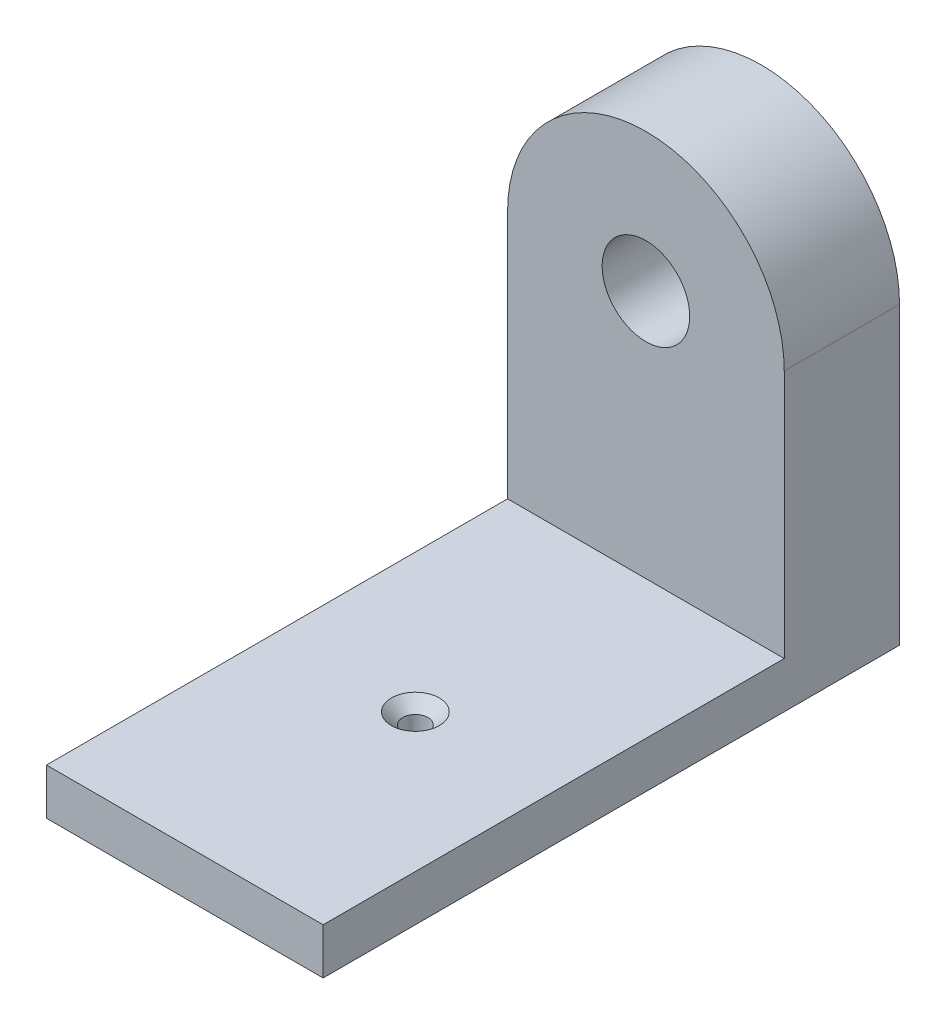
ISO-10303-21;
HEADER;
FILE_DESCRIPTION(('STEP AP214'),'2;1');
FILE_NAME('part.step','',(''),(''),'','','');
FILE_SCHEMA(('AUTOMOTIVE_DESIGN { 1 0 10303 214 1 1 1 1 }'));
ENDSEC;
DATA;
#1=APPLICATION_CONTEXT('core data for automotive mechanical design processes');
#2=APPLICATION_PROTOCOL_DEFINITION('international standard','automotive_design',2000,#1);
#3=PRODUCT_CONTEXT('',#1,'mechanical');
#4=PRODUCT('Part','Part','',(#3));
#5=PRODUCT_RELATED_PRODUCT_CATEGORY('part','',(#4));
#6=PRODUCT_DEFINITION_FORMATION('','',#4);
#7=PRODUCT_DEFINITION_CONTEXT('part definition',#1,'design');
#8=PRODUCT_DEFINITION('design','',#6,#7);
#9=PRODUCT_DEFINITION_SHAPE('','',#8);
#10=(LENGTH_UNIT() NAMED_UNIT(*) SI_UNIT(.MILLI.,.METRE.));
#11=(NAMED_UNIT(*) PLANE_ANGLE_UNIT() SI_UNIT($,.RADIAN.));
#12=(NAMED_UNIT(*) SI_UNIT($,.STERADIAN.) SOLID_ANGLE_UNIT());
#13=UNCERTAINTY_MEASURE_WITH_UNIT(LENGTH_MEASURE(1.E-05),#10,'distance_accuracy_value','');
#14=(GEOMETRIC_REPRESENTATION_CONTEXT(3) GLOBAL_UNCERTAINTY_ASSIGNED_CONTEXT((#13)) GLOBAL_UNIT_ASSIGNED_CONTEXT((#10,
#11,#12)) REPRESENTATION_CONTEXT('',''));
#15=CARTESIAN_POINT('',(0.,0.,0.));
#16=DIRECTION('',(0.,0.,1.));
#17=DIRECTION('',(1.,0.,0.));
#18=AXIS2_PLACEMENT_3D('',#15,#16,#17);
#19=CARTESIAN_POINT('',(0.,10.,0.));
#20=DIRECTION('',(1.,0.,0.));
#21=DIRECTION('',(0.,0.,-1.));
#22=AXIS2_PLACEMENT_3D('',#19,#20,#21);
#23=PLANE('',#22);
#24=DIRECTION('',(0.,0.,1.));
#25=VECTOR('',#24,1.);
#26=CARTESIAN_POINT('',(0.,0.,0.));
#27=LINE('',#26,#25);
#28=CARTESIAN_POINT('',(0.,0.,-125.));
#29=VERTEX_POINT('',#28);
#30=CARTESIAN_POINT('',(0.,0.,0.));
#31=VERTEX_POINT('',#30);
#32=EDGE_CURVE('E96',#29,#31,#27,.T.);
#33=ORIENTED_EDGE('',*,*,#32,.T.);
#34=DIRECTION('',(0.,-1.,0.));
#35=VECTOR('',#34,1.);
#36=CARTESIAN_POINT('',(0.,10.,0.));
#37=LINE('',#36,#35);
#38=CARTESIAN_POINT('',(0.,10.,0.));
#39=VERTEX_POINT('',#38);
#40=EDGE_CURVE('E11',#39,#31,#37,.T.);
#41=ORIENTED_EDGE('',*,*,#40,.F.);
#42=DIRECTION('',(0.,0.,1.));
#43=VECTOR('',#42,1.);
#44=CARTESIAN_POINT('',(0.,10.,0.));
#45=LINE('',#44,#43);
#46=CARTESIAN_POINT('',(0.,10.,-100.));
#47=VERTEX_POINT('',#46);
#48=EDGE_CURVE('E90',#47,#39,#45,.T.);
#49=ORIENTED_EDGE('',*,*,#48,.F.);
#50=DIRECTION('',(0.,1.,0.));
#51=VECTOR('',#50,1.);
#52=CARTESIAN_POINT('',(0.,10.,-100.));
#53=LINE('',#52,#51);
#54=CARTESIAN_POINT('',(0.,64.,-100.));
#55=VERTEX_POINT('',#54);
#56=EDGE_CURVE('E48',#47,#55,#53,.T.);
#57=ORIENTED_EDGE('',*,*,#56,.T.);
#58=DIRECTION('',(0.,0.,-1.));
#59=VECTOR('',#58,1.);
#60=CARTESIAN_POINT('',(0.,64.,-100.));
#61=LINE('',#60,#59);
#62=CARTESIAN_POINT('',(0.,64.,-125.));
#63=VERTEX_POINT('',#62);
#64=EDGE_CURVE('E98',#55,#63,#61,.T.);
#65=ORIENTED_EDGE('',*,*,#64,.T.);
#66=DIRECTION('',(0.,-1.,0.));
#67=VECTOR('',#66,1.);
#68=CARTESIAN_POINT('',(0.,10.,-125.));
#69=LINE('',#68,#67);
#70=EDGE_CURVE('E83',#63,#29,#69,.T.);
#71=ORIENTED_EDGE('',*,*,#70,.T.);
#72=EDGE_LOOP('',(#33,#41,#49,#57,#65,#71));
#73=FACE_BOUND('',#72,.T.);
#74=ADVANCED_FACE('F32',(#73),#23,.F.);
#75=CARTESIAN_POINT('',(0.,10.,0.));
#76=DIRECTION('',(0.,0.,-1.));
#77=DIRECTION('',(-1.,0.,0.));
#78=AXIS2_PLACEMENT_3D('',#75,#76,#77);
#79=PLANE('',#78);
#80=DIRECTION('',(1.,0.,0.));
#81=VECTOR('',#80,1.);
#82=CARTESIAN_POINT('',(0.,0.,0.));
#83=LINE('',#82,#81);
#84=CARTESIAN_POINT('',(60.,0.,0.));
#85=VERTEX_POINT('',#84);
#86=EDGE_CURVE('E103',#31,#85,#83,.T.);
#87=ORIENTED_EDGE('',*,*,#86,.T.);
#88=DIRECTION('',(0.,-1.,0.));
#89=VECTOR('',#88,1.);
#90=CARTESIAN_POINT('',(60.,10.,0.));
#91=LINE('',#90,#89);
#92=CARTESIAN_POINT('',(60.,10.,0.));
#93=VERTEX_POINT('',#92);
#94=EDGE_CURVE('E40',#93,#85,#91,.T.);
#95=ORIENTED_EDGE('',*,*,#94,.F.);
#96=DIRECTION('',(1.,0.,0.));
#97=VECTOR('',#96,1.);
#98=CARTESIAN_POINT('',(0.,10.,0.));
#99=LINE('',#98,#97);
#100=EDGE_CURVE('E57',#39,#93,#99,.T.);
#101=ORIENTED_EDGE('',*,*,#100,.F.);
#102=ORIENTED_EDGE('',*,*,#40,.T.);
#103=EDGE_LOOP('',(#87,#95,#101,#102));
#104=FACE_BOUND('',#103,.T.);
#105=ADVANCED_FACE('F170',(#104),#79,.F.);
#106=CARTESIAN_POINT('',(60.,10.,0.));
#107=DIRECTION('',(-1.,0.,0.));
#108=DIRECTION('',(0.,0.,1.));
#109=AXIS2_PLACEMENT_3D('',#106,#107,#108);
#110=PLANE('',#109);
#111=DIRECTION('',(0.,0.,-1.));
#112=VECTOR('',#111,1.);
#113=CARTESIAN_POINT('',(60.,0.,0.));
#114=LINE('',#113,#112);
#115=CARTESIAN_POINT('',(60.,0.,-125.));
#116=VERTEX_POINT('',#115);
#117=EDGE_CURVE('E91',#85,#116,#114,.T.);
#118=ORIENTED_EDGE('',*,*,#117,.T.);
#119=DIRECTION('',(0.,-1.,0.));
#120=VECTOR('',#119,1.);
#121=CARTESIAN_POINT('',(60.,10.,-125.));
#122=LINE('',#121,#120);
#123=CARTESIAN_POINT('',(60.,64.,-125.));
#124=VERTEX_POINT('',#123);
#125=EDGE_CURVE('E86',#124,#116,#122,.T.);
#126=ORIENTED_EDGE('',*,*,#125,.F.);
#127=DIRECTION('',(0.,0.,-1.));
#128=VECTOR('',#127,1.);
#129=CARTESIAN_POINT('',(60.,64.,-100.));
#130=LINE('',#129,#128);
#131=CARTESIAN_POINT('',(60.,64.,-100.));
#132=VERTEX_POINT('',#131);
#133=EDGE_CURVE('E104',#132,#124,#130,.T.);
#134=ORIENTED_EDGE('',*,*,#133,.F.);
#135=DIRECTION('',(0.,-1.,0.));
#136=VECTOR('',#135,1.);
#137=CARTESIAN_POINT('',(60.,10.,-100.));
#138=LINE('',#137,#136);
#139=CARTESIAN_POINT('',(60.,10.,-100.));
#140=VERTEX_POINT('',#139);
#141=EDGE_CURVE('E135',#132,#140,#138,.T.);
#142=ORIENTED_EDGE('',*,*,#141,.T.);
#143=DIRECTION('',(0.,0.,-1.));
#144=VECTOR('',#143,1.);
#145=CARTESIAN_POINT('',(60.,10.,0.));
#146=LINE('',#145,#144);
#147=EDGE_CURVE('E100',#93,#140,#146,.T.);
#148=ORIENTED_EDGE('',*,*,#147,.F.);
#149=ORIENTED_EDGE('',*,*,#94,.T.);
#150=EDGE_LOOP('',(#118,#126,#134,#142,#148,#149));
#151=FACE_BOUND('',#150,.T.);
#152=ADVANCED_FACE('F132',(#151),#110,.F.);
#153=CARTESIAN_POINT('',(0.,10.,-125.));
#154=DIRECTION('',(0.,0.,1.));
#155=DIRECTION('',(1.,0.,0.));
#156=AXIS2_PLACEMENT_3D('',#153,#154,#155);
#157=PLANE('',#156);
#158=DIRECTION('',(-1.,0.,0.));
#159=VECTOR('',#158,1.);
#160=CARTESIAN_POINT('',(0.,0.,-125.));
#161=LINE('',#160,#159);
#162=EDGE_CURVE('E77',#116,#29,#161,.T.);
#163=ORIENTED_EDGE('',*,*,#162,.T.);
#164=ORIENTED_EDGE('',*,*,#70,.F.);
#165=CARTESIAN_POINT('',(30.,64.,-125.));
#166=DIRECTION('',(0.,0.,-1.));
#167=DIRECTION('',(-1.,0.,0.));
#168=AXIS2_PLACEMENT_3D('',#165,#166,#167);
#169=CIRCLE('',#168,30.);
#170=EDGE_CURVE('E137',#63,#124,#169,.T.);
#171=ORIENTED_EDGE('',*,*,#170,.T.);
#172=ORIENTED_EDGE('',*,*,#125,.T.);
#173=EDGE_LOOP('',(#163,#164,#171,#172));
#174=FACE_BOUND('',#173,.T.);
#175=CARTESIAN_POINT('',(30.,64.,-125.));
#176=DIRECTION('',(0.,0.,-1.));
#177=DIRECTION('',(-1.,0.,0.));
#178=AXIS2_PLACEMENT_3D('',#175,#176,#177);
#179=CIRCLE('',#178,9.5);
#180=CARTESIAN_POINT('',(20.5,64.,-125.));
#181=VERTEX_POINT('',#180);
#182=EDGE_CURVE('E148',#181,#181,#179,.T.);
#183=ORIENTED_EDGE('',*,*,#182,.F.);
#184=EDGE_LOOP('',(#183));
#185=FACE_BOUND('',#184,.T.);
#186=ADVANCED_FACE('F79',(#174,#185),#157,.F.);
#187=CARTESIAN_POINT('',(0.,10.,-125.));
#188=DIRECTION('',(0.,-1.,0.));
#189=DIRECTION('',(0.,0.,-1.));
#190=AXIS2_PLACEMENT_3D('',#187,#188,#189);
#191=PLANE('',#190);
#192=CARTESIAN_POINT('',(30.,10.,-50.));
#193=DIRECTION('',(0.,1.,0.));
#194=DIRECTION('',(0.,0.,1.));
#195=AXIS2_PLACEMENT_3D('',#192,#193,#194);
#196=CIRCLE('',#195,5.2);
#197=CARTESIAN_POINT('',(30.,10.,-44.8));
#198=VERTEX_POINT('',#197);
#199=EDGE_CURVE('E191',#198,#198,#196,.T.);
#200=ORIENTED_EDGE('',*,*,#199,.F.);
#201=EDGE_LOOP('',(#200));
#202=FACE_BOUND('',#201,.T.);
#203=ORIENTED_EDGE('',*,*,#147,.T.);
#204=DIRECTION('',(-1.,0.,0.));
#205=VECTOR('',#204,1.);
#206=CARTESIAN_POINT('',(60.,10.,-100.));
#207=LINE('',#206,#205);
#208=EDGE_CURVE('E125',#140,#47,#207,.T.);
#209=ORIENTED_EDGE('',*,*,#208,.T.);
#210=ORIENTED_EDGE('',*,*,#48,.T.);
#211=ORIENTED_EDGE('',*,*,#100,.T.);
#212=EDGE_LOOP('',(#203,#209,#210,#211));
#213=FACE_BOUND('',#212,.T.);
#214=ADVANCED_FACE('F124',(#202,#213),#191,.F.);
#215=CARTESIAN_POINT('',(0.,0.,-125.));
#216=DIRECTION('',(0.,-1.,0.));
#217=DIRECTION('',(0.,0.,-1.));
#218=AXIS2_PLACEMENT_3D('',#215,#216,#217);
#219=PLANE('',#218);
#220=CARTESIAN_POINT('',(30.,0.,-50.));
#221=DIRECTION('',(0.,1.,0.));
#222=DIRECTION('',(0.,0.,1.));
#223=AXIS2_PLACEMENT_3D('',#220,#221,#222);
#224=CIRCLE('',#223,2.74999999999999);
#225=CARTESIAN_POINT('',(30.,0.,-47.25));
#226=VERTEX_POINT('',#225);
#227=EDGE_CURVE('E196',#226,#226,#224,.T.);
#228=ORIENTED_EDGE('',*,*,#227,.T.);
#229=EDGE_LOOP('',(#228));
#230=FACE_BOUND('',#229,.T.);
#231=ORIENTED_EDGE('',*,*,#32,.F.);
#232=ORIENTED_EDGE('',*,*,#162,.F.);
#233=ORIENTED_EDGE('',*,*,#117,.F.);
#234=ORIENTED_EDGE('',*,*,#86,.F.);
#235=EDGE_LOOP('',(#231,#232,#233,#234));
#236=FACE_BOUND('',#235,.T.);
#237=ADVANCED_FACE('F102',(#230,#236),#219,.T.);
#238=CARTESIAN_POINT('',(30.,64.,-100.));
#239=DIRECTION('',(0.,0.,-1.));
#240=DIRECTION('',(-1.,0.,0.));
#241=AXIS2_PLACEMENT_3D('',#238,#239,#240);
#242=CYLINDRICAL_SURFACE('',#241,30.);
#243=ORIENTED_EDGE('',*,*,#170,.F.);
#244=ORIENTED_EDGE('',*,*,#64,.F.);
#245=CARTESIAN_POINT('',(30.,64.,-100.));
#246=DIRECTION('',(0.,0.,-1.));
#247=DIRECTION('',(-1.,0.,0.));
#248=AXIS2_PLACEMENT_3D('',#245,#246,#247);
#249=CIRCLE('',#248,30.);
#250=EDGE_CURVE('E143',#55,#132,#249,.T.);
#251=ORIENTED_EDGE('',*,*,#250,.T.);
#252=ORIENTED_EDGE('',*,*,#133,.T.);
#253=EDGE_LOOP('',(#243,#244,#251,#252));
#254=FACE_BOUND('',#253,.T.);
#255=ADVANCED_FACE('F151',(#254),#242,.T.);
#256=CARTESIAN_POINT('',(30.,64.,-100.));
#257=DIRECTION('',(0.,0.,-1.));
#258=DIRECTION('',(-1.,0.,0.));
#259=AXIS2_PLACEMENT_3D('',#256,#257,#258);
#260=PLANE('',#259);
#261=CARTESIAN_POINT('',(30.,64.,-100.));
#262=DIRECTION('',(0.,0.,-1.));
#263=DIRECTION('',(-1.,0.,0.));
#264=AXIS2_PLACEMENT_3D('',#261,#262,#263);
#265=CIRCLE('',#264,9.5);
#266=CARTESIAN_POINT('',(20.5,64.,-100.));
#267=VERTEX_POINT('',#266);
#268=EDGE_CURVE('E138',#267,#267,#265,.T.);
#269=ORIENTED_EDGE('',*,*,#268,.T.);
#270=EDGE_LOOP('',(#269));
#271=FACE_BOUND('',#270,.T.);
#272=ORIENTED_EDGE('',*,*,#141,.F.);
#273=ORIENTED_EDGE('',*,*,#250,.F.);
#274=ORIENTED_EDGE('',*,*,#56,.F.);
#275=ORIENTED_EDGE('',*,*,#208,.F.);
#276=EDGE_LOOP('',(#272,#273,#274,#275));
#277=FACE_BOUND('',#276,.T.);
#278=ADVANCED_FACE('F153',(#271,#277),#260,.F.);
#279=CARTESIAN_POINT('',(30.,64.,-100.));
#280=DIRECTION('',(0.,0.,-1.));
#281=DIRECTION('',(-1.,0.,0.));
#282=AXIS2_PLACEMENT_3D('',#279,#280,#281);
#283=CYLINDRICAL_SURFACE('',#282,9.5);
#284=ORIENTED_EDGE('',*,*,#268,.F.);
#285=EDGE_LOOP('',(#284));
#286=FACE_BOUND('',#285,.T.);
#287=ORIENTED_EDGE('',*,*,#182,.T.);
#288=EDGE_LOOP('',(#287));
#289=FACE_BOUND('',#288,.T.);
#290=ADVANCED_FACE('F157',(#286,#289),#283,.F.);
#291=CARTESIAN_POINT('',(30.,10.,-50.));
#292=DIRECTION('',(0.,1.,0.));
#293=DIRECTION('',(0.,0.,1.));
#294=AXIS2_PLACEMENT_3D('',#291,#292,#293);
#295=CYLINDRICAL_SURFACE('',#294,2.74999999999999);
#296=ORIENTED_EDGE('',*,*,#227,.F.);
#297=EDGE_LOOP('',(#296));
#298=FACE_BOUND('',#297,.T.);
#299=CARTESIAN_POINT('',(30.,7.55,-50.));
#300=DIRECTION('',(0.,1.,0.));
#301=DIRECTION('',(0.,0.,1.));
#302=AXIS2_PLACEMENT_3D('',#299,#300,#301);
#303=CIRCLE('',#302,2.75);
#304=CARTESIAN_POINT('',(30.,7.55,-47.25));
#305=VERTEX_POINT('',#304);
#306=EDGE_CURVE('E193',#305,#305,#303,.T.);
#307=ORIENTED_EDGE('',*,*,#306,.T.);
#308=EDGE_LOOP('',(#307));
#309=FACE_BOUND('',#308,.T.);
#310=ADVANCED_FACE('F164',(#298,#309),#295,.F.);
#311=CARTESIAN_POINT('',(30.,10.,-50.));
#312=DIRECTION('',(0.,1.,0.));
#313=DIRECTION('',(0.,0.,1.));
#314=AXIS2_PLACEMENT_3D('',#311,#312,#313);
#315=CONICAL_SURFACE('',#314,5.2,0.785398163397448);
#316=ORIENTED_EDGE('',*,*,#306,.F.);
#317=EDGE_LOOP('',(#316));
#318=FACE_BOUND('',#317,.T.);
#319=ORIENTED_EDGE('',*,*,#199,.T.);
#320=EDGE_LOOP('',(#319));
#321=FACE_BOUND('',#320,.T.);
#322=ADVANCED_FACE('F208',(#318,#321),#315,.F.);
#323=CLOSED_SHELL('',(#74,#105,#152,#186,#214,#237,#255,#278,#290,#310,#322));
#324=MANIFOLD_SOLID_BREP('B2',#323);
#325=ADVANCED_BREP_SHAPE_REPRESENTATION('',(#18,#324),#14);
#326=SHAPE_DEFINITION_REPRESENTATION(#9,#325);
ENDSEC;
END-ISO-10303-21;
